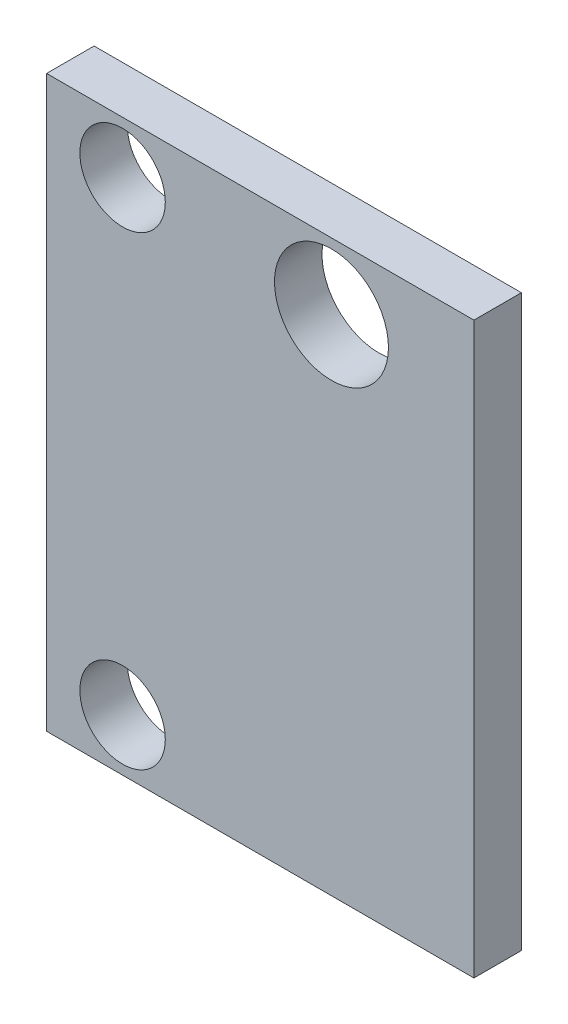
ISO-10303-21;
HEADER;
FILE_DESCRIPTION(('STEP AP214'),'2;1');
FILE_NAME('part.step','',(''),(''),'','','');
FILE_SCHEMA(('AUTOMOTIVE_DESIGN { 1 0 10303 214 1 1 1 1 }'));
ENDSEC;
DATA;
#1=APPLICATION_CONTEXT('core data for automotive mechanical design processes');
#2=APPLICATION_PROTOCOL_DEFINITION('international standard','automotive_design',2000,#1);
#3=PRODUCT_CONTEXT('',#1,'mechanical');
#4=PRODUCT('Part','Part','',(#3));
#5=PRODUCT_RELATED_PRODUCT_CATEGORY('part','',(#4));
#6=PRODUCT_DEFINITION_FORMATION('','',#4);
#7=PRODUCT_DEFINITION_CONTEXT('part definition',#1,'design');
#8=PRODUCT_DEFINITION('design','',#6,#7);
#9=PRODUCT_DEFINITION_SHAPE('','',#8);
#10=(LENGTH_UNIT() NAMED_UNIT(*) SI_UNIT(.MILLI.,.METRE.));
#11=(NAMED_UNIT(*) PLANE_ANGLE_UNIT() SI_UNIT($,.RADIAN.));
#12=(NAMED_UNIT(*) SI_UNIT($,.STERADIAN.) SOLID_ANGLE_UNIT());
#13=UNCERTAINTY_MEASURE_WITH_UNIT(LENGTH_MEASURE(1.E-05),#10,'distance_accuracy_value','');
#14=(GEOMETRIC_REPRESENTATION_CONTEXT(3) GLOBAL_UNCERTAINTY_ASSIGNED_CONTEXT((#13)) GLOBAL_UNIT_ASSIGNED_CONTEXT((#10,
#11,#12)) REPRESENTATION_CONTEXT('',''));
#15=CARTESIAN_POINT('',(0.,0.,0.));
#16=DIRECTION('',(0.,0.,1.));
#17=DIRECTION('',(1.,0.,0.));
#18=AXIS2_PLACEMENT_3D('',#15,#16,#17);
#19=CARTESIAN_POINT('',(0.,0.,5.));
#20=DIRECTION('',(0.,0.,-1.));
#21=DIRECTION('',(-1.,0.,0.));
#22=AXIS2_PLACEMENT_3D('',#19,#20,#21);
#23=PLANE('',#22);
#24=CARTESIAN_POINT('',(7.49999999999998,23.,5.));
#25=DIRECTION('',(0.,0.,1.));
#26=DIRECTION('',(1.,0.,0.));
#27=AXIS2_PLACEMENT_3D('',#24,#25,#26);
#28=CIRCLE('',#27,6.);
#29=CARTESIAN_POINT('',(13.5,23.,5.));
#30=VERTEX_POINT('',#29);
#31=EDGE_CURVE('E147',#30,#30,#28,.T.);
#32=ORIENTED_EDGE('',*,*,#31,.F.);
#33=EDGE_LOOP('',(#32));
#34=FACE_BOUND('',#33,.T.);
#35=DIRECTION('',(0.,1.,0.));
#36=VECTOR('',#35,1.);
#37=CARTESIAN_POINT('',(22.5,-30.,5.));
#38=LINE('',#37,#36);
#39=CARTESIAN_POINT('',(22.5,-30.,5.));
#40=VERTEX_POINT('',#39);
#41=CARTESIAN_POINT('',(22.5,30.,5.));
#42=VERTEX_POINT('',#41);
#43=EDGE_CURVE('E93',#40,#42,#38,.T.);
#44=ORIENTED_EDGE('',*,*,#43,.T.);
#45=DIRECTION('',(-1.,0.,0.));
#46=VECTOR('',#45,1.);
#47=CARTESIAN_POINT('',(-22.5,30.,5.));
#48=LINE('',#47,#46);
#49=CARTESIAN_POINT('',(-22.5,30.,5.));
#50=VERTEX_POINT('',#49);
#51=EDGE_CURVE('E88',#42,#50,#48,.T.);
#52=ORIENTED_EDGE('',*,*,#51,.T.);
#53=DIRECTION('',(0.,-1.,0.));
#54=VECTOR('',#53,1.);
#55=CARTESIAN_POINT('',(-22.5,-30.,5.));
#56=LINE('',#55,#54);
#57=CARTESIAN_POINT('',(-22.5,-30.,5.));
#58=VERTEX_POINT('',#57);
#59=EDGE_CURVE('E91',#50,#58,#56,.T.);
#60=ORIENTED_EDGE('',*,*,#59,.T.);
#61=DIRECTION('',(1.,0.,0.));
#62=VECTOR('',#61,1.);
#63=CARTESIAN_POINT('',(-22.5,-30.,5.));
#64=LINE('',#63,#62);
#65=EDGE_CURVE('E58',#58,#40,#64,.T.);
#66=ORIENTED_EDGE('',*,*,#65,.T.);
#67=EDGE_LOOP('',(#44,#52,#60,#66));
#68=FACE_BOUND('',#67,.T.);
#69=CARTESIAN_POINT('',(-14.5,24.5,5.));
#70=DIRECTION('',(0.,0.,1.));
#71=DIRECTION('',(1.,0.,0.));
#72=AXIS2_PLACEMENT_3D('',#69,#70,#71);
#73=CIRCLE('',#72,4.5);
#74=CARTESIAN_POINT('',(-9.99999999999999,24.5,5.));
#75=VERTEX_POINT('',#74);
#76=EDGE_CURVE('E114',#75,#75,#73,.T.);
#77=ORIENTED_EDGE('',*,*,#76,.F.);
#78=EDGE_LOOP('',(#77));
#79=FACE_BOUND('',#78,.T.);
#80=CARTESIAN_POINT('',(-14.5,-24.5,5.));
#81=DIRECTION('',(0.,0.,1.));
#82=DIRECTION('',(1.,0.,0.));
#83=AXIS2_PLACEMENT_3D('',#80,#81,#82);
#84=CIRCLE('',#83,4.5);
#85=CARTESIAN_POINT('',(-9.99999999999998,-24.5,5.));
#86=VERTEX_POINT('',#85);
#87=EDGE_CURVE('E136',#86,#86,#84,.T.);
#88=ORIENTED_EDGE('',*,*,#87,.F.);
#89=EDGE_LOOP('',(#88));
#90=FACE_BOUND('',#89,.T.);
#91=ADVANCED_FACE('F39',(#34,#68,#79,#90),#23,.F.);
#92=CARTESIAN_POINT('',(0.,0.,0.));
#93=DIRECTION('',(0.,0.,-1.));
#94=DIRECTION('',(-1.,0.,0.));
#95=AXIS2_PLACEMENT_3D('',#92,#93,#94);
#96=PLANE('',#95);
#97=CARTESIAN_POINT('',(7.49999999999998,23.,0.));
#98=DIRECTION('',(0.,0.,-1.));
#99=DIRECTION('',(-1.,0.,0.));
#100=AXIS2_PLACEMENT_3D('',#97,#98,#99);
#101=CIRCLE('',#100,6.);
#102=CARTESIAN_POINT('',(1.49999999999998,23.,0.));
#103=VERTEX_POINT('',#102);
#104=EDGE_CURVE('E43',#103,#103,#101,.T.);
#105=ORIENTED_EDGE('',*,*,#104,.F.);
#106=EDGE_LOOP('',(#105));
#107=FACE_BOUND('',#106,.T.);
#108=CARTESIAN_POINT('',(-14.5,24.5,0.));
#109=DIRECTION('',(0.,0.,1.));
#110=DIRECTION('',(1.,0.,0.));
#111=AXIS2_PLACEMENT_3D('',#108,#109,#110);
#112=CIRCLE('',#111,4.5);
#113=CARTESIAN_POINT('',(-9.99999999999999,24.5,0.));
#114=VERTEX_POINT('',#113);
#115=EDGE_CURVE('E132',#114,#114,#112,.T.);
#116=ORIENTED_EDGE('',*,*,#115,.T.);
#117=EDGE_LOOP('',(#116));
#118=FACE_BOUND('',#117,.T.);
#119=DIRECTION('',(0.,1.,0.));
#120=VECTOR('',#119,1.);
#121=CARTESIAN_POINT('',(22.5,-30.,0.));
#122=LINE('',#121,#120);
#123=CARTESIAN_POINT('',(22.5,-30.,0.));
#124=VERTEX_POINT('',#123);
#125=CARTESIAN_POINT('',(22.5,30.,0.));
#126=VERTEX_POINT('',#125);
#127=EDGE_CURVE('E110',#124,#126,#122,.T.);
#128=ORIENTED_EDGE('',*,*,#127,.F.);
#129=DIRECTION('',(1.,0.,0.));
#130=VECTOR('',#129,1.);
#131=CARTESIAN_POINT('',(-22.5,-30.,0.));
#132=LINE('',#131,#130);
#133=CARTESIAN_POINT('',(-22.5,-30.,0.));
#134=VERTEX_POINT('',#133);
#135=EDGE_CURVE('E81',#134,#124,#132,.T.);
#136=ORIENTED_EDGE('',*,*,#135,.F.);
#137=DIRECTION('',(0.,-1.,0.));
#138=VECTOR('',#137,1.);
#139=CARTESIAN_POINT('',(-22.5,-30.,0.));
#140=LINE('',#139,#138);
#141=CARTESIAN_POINT('',(-22.5,30.,0.));
#142=VERTEX_POINT('',#141);
#143=EDGE_CURVE('E75',#142,#134,#140,.T.);
#144=ORIENTED_EDGE('',*,*,#143,.F.);
#145=DIRECTION('',(-1.,0.,0.));
#146=VECTOR('',#145,1.);
#147=CARTESIAN_POINT('',(-22.5,30.,0.));
#148=LINE('',#147,#146);
#149=EDGE_CURVE('E98',#126,#142,#148,.T.);
#150=ORIENTED_EDGE('',*,*,#149,.F.);
#151=EDGE_LOOP('',(#128,#136,#144,#150));
#152=FACE_BOUND('',#151,.T.);
#153=CARTESIAN_POINT('',(-14.5,-24.5,0.));
#154=DIRECTION('',(0.,0.,1.));
#155=DIRECTION('',(1.,0.,0.));
#156=AXIS2_PLACEMENT_3D('',#153,#154,#155);
#157=CIRCLE('',#156,4.5);
#158=CARTESIAN_POINT('',(-9.99999999999998,-24.5,0.));
#159=VERTEX_POINT('',#158);
#160=EDGE_CURVE('E140',#159,#159,#157,.T.);
#161=ORIENTED_EDGE('',*,*,#160,.T.);
#162=EDGE_LOOP('',(#161));
#163=FACE_BOUND('',#162,.T.);
#164=ADVANCED_FACE('F127',(#107,#118,#152,#163),#96,.T.);
#165=CARTESIAN_POINT('',(22.5,-30.,5.));
#166=DIRECTION('',(-1.,0.,0.));
#167=DIRECTION('',(0.,0.,1.));
#168=AXIS2_PLACEMENT_3D('',#165,#166,#167);
#169=PLANE('',#168);
#170=ORIENTED_EDGE('',*,*,#127,.T.);
#171=DIRECTION('',(0.,0.,-1.));
#172=VECTOR('',#171,1.);
#173=CARTESIAN_POINT('',(22.5,30.,5.));
#174=LINE('',#173,#172);
#175=EDGE_CURVE('E11',#42,#126,#174,.T.);
#176=ORIENTED_EDGE('',*,*,#175,.F.);
#177=ORIENTED_EDGE('',*,*,#43,.F.);
#178=DIRECTION('',(0.,0.,-1.));
#179=VECTOR('',#178,1.);
#180=CARTESIAN_POINT('',(22.5,-30.,5.));
#181=LINE('',#180,#179);
#182=EDGE_CURVE('E106',#40,#124,#181,.T.);
#183=ORIENTED_EDGE('',*,*,#182,.T.);
#184=EDGE_LOOP('',(#170,#176,#177,#183));
#185=FACE_BOUND('',#184,.T.);
#186=ADVANCED_FACE('F41',(#185),#169,.F.);
#187=CARTESIAN_POINT('',(-22.5,30.,5.));
#188=DIRECTION('',(0.,-1.,0.));
#189=DIRECTION('',(0.,0.,-1.));
#190=AXIS2_PLACEMENT_3D('',#187,#188,#189);
#191=PLANE('',#190);
#192=ORIENTED_EDGE('',*,*,#149,.T.);
#193=DIRECTION('',(0.,0.,-1.));
#194=VECTOR('',#193,1.);
#195=CARTESIAN_POINT('',(-22.5,30.,5.));
#196=LINE('',#195,#194);
#197=EDGE_CURVE('E50',#50,#142,#196,.T.);
#198=ORIENTED_EDGE('',*,*,#197,.F.);
#199=ORIENTED_EDGE('',*,*,#51,.F.);
#200=ORIENTED_EDGE('',*,*,#175,.T.);
#201=EDGE_LOOP('',(#192,#198,#199,#200));
#202=FACE_BOUND('',#201,.T.);
#203=ADVANCED_FACE('F97',(#202),#191,.F.);
#204=CARTESIAN_POINT('',(-22.5,-30.,5.));
#205=DIRECTION('',(1.,0.,0.));
#206=DIRECTION('',(0.,1.,0.));
#207=AXIS2_PLACEMENT_3D('',#204,#205,#206);
#208=PLANE('',#207);
#209=ORIENTED_EDGE('',*,*,#143,.T.);
#210=DIRECTION('',(0.,0.,-1.));
#211=VECTOR('',#210,1.);
#212=CARTESIAN_POINT('',(-22.5,-30.,5.));
#213=LINE('',#212,#211);
#214=EDGE_CURVE('E100',#58,#134,#213,.T.);
#215=ORIENTED_EDGE('',*,*,#214,.F.);
#216=ORIENTED_EDGE('',*,*,#59,.F.);
#217=ORIENTED_EDGE('',*,*,#197,.T.);
#218=EDGE_LOOP('',(#209,#215,#216,#217));
#219=FACE_BOUND('',#218,.T.);
#220=ADVANCED_FACE('F102',(#219),#208,.F.);
#221=CARTESIAN_POINT('',(-22.5,-30.,5.));
#222=DIRECTION('',(0.,1.,0.));
#223=DIRECTION('',(0.,0.,1.));
#224=AXIS2_PLACEMENT_3D('',#221,#222,#223);
#225=PLANE('',#224);
#226=ORIENTED_EDGE('',*,*,#135,.T.);
#227=ORIENTED_EDGE('',*,*,#182,.F.);
#228=ORIENTED_EDGE('',*,*,#65,.F.);
#229=ORIENTED_EDGE('',*,*,#214,.T.);
#230=EDGE_LOOP('',(#226,#227,#228,#229));
#231=FACE_BOUND('',#230,.T.);
#232=ADVANCED_FACE('F124',(#231),#225,.F.);
#233=CARTESIAN_POINT('',(-14.5,24.5,5.));
#234=DIRECTION('',(0.,0.,-1.));
#235=DIRECTION('',(-1.,0.,0.));
#236=AXIS2_PLACEMENT_3D('',#233,#234,#235);
#237=CYLINDRICAL_SURFACE('',#236,4.5);
#238=ORIENTED_EDGE('',*,*,#76,.T.);
#239=EDGE_LOOP('',(#238));
#240=FACE_BOUND('',#239,.T.);
#241=ORIENTED_EDGE('',*,*,#115,.F.);
#242=EDGE_LOOP('',(#241));
#243=FACE_BOUND('',#242,.T.);
#244=ADVANCED_FACE('F163',(#240,#243),#237,.F.);
#245=CARTESIAN_POINT('',(-14.5,-24.5,5.));
#246=DIRECTION('',(0.,0.,-1.));
#247=DIRECTION('',(-1.,0.,0.));
#248=AXIS2_PLACEMENT_3D('',#245,#246,#247);
#249=CYLINDRICAL_SURFACE('',#248,4.5);
#250=ORIENTED_EDGE('',*,*,#87,.T.);
#251=EDGE_LOOP('',(#250));
#252=FACE_BOUND('',#251,.T.);
#253=ORIENTED_EDGE('',*,*,#160,.F.);
#254=EDGE_LOOP('',(#253));
#255=FACE_BOUND('',#254,.T.);
#256=ADVANCED_FACE('F165',(#252,#255),#249,.F.);
#257=CARTESIAN_POINT('',(7.49999999999998,23.,-5.));
#258=DIRECTION('',(0.,0.,1.));
#259=DIRECTION('',(1.,0.,0.));
#260=AXIS2_PLACEMENT_3D('',#257,#258,#259);
#261=CYLINDRICAL_SURFACE('',#260,6.);
#262=ORIENTED_EDGE('',*,*,#104,.T.);
#263=EDGE_LOOP('',(#262));
#264=FACE_BOUND('',#263,.T.);
#265=ORIENTED_EDGE('',*,*,#31,.T.);
#266=EDGE_LOOP('',(#265));
#267=FACE_BOUND('',#266,.T.);
#268=ADVANCED_FACE('F156',(#264,#267),#261,.F.);
#269=CLOSED_SHELL('',(#91,#164,#186,#203,#220,#232,#244,#256,#268));
#270=MANIFOLD_SOLID_BREP('B2',#269);
#271=ADVANCED_BREP_SHAPE_REPRESENTATION('',(#18,#270),#14);
#272=SHAPE_DEFINITION_REPRESENTATION(#9,#271);
ENDSEC;
END-ISO-10303-21;
